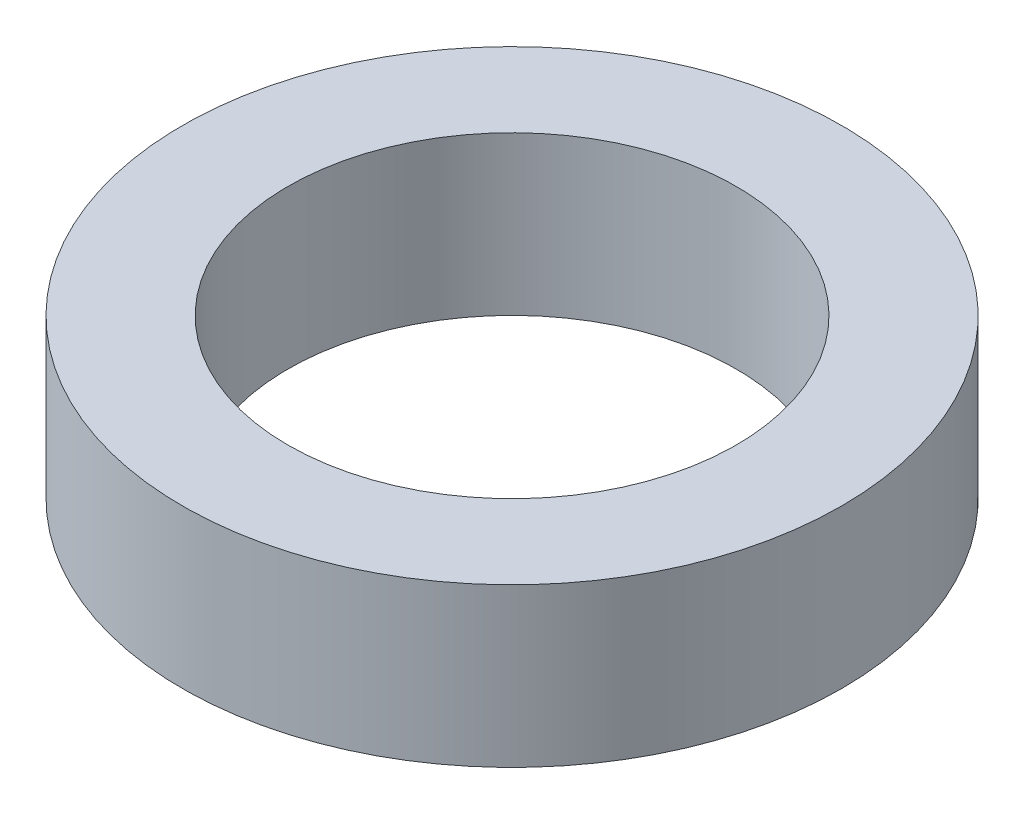
ISO-10303-21;
HEADER;
FILE_DESCRIPTION(('STEP AP214'),'2;1');
FILE_NAME('part.step','',(''),(''),'','','');
FILE_SCHEMA(('AUTOMOTIVE_DESIGN { 1 0 10303 214 1 1 1 1 }'));
ENDSEC;
DATA;
#1=APPLICATION_CONTEXT('core data for automotive mechanical design processes');
#2=APPLICATION_PROTOCOL_DEFINITION('international standard','automotive_design',2000,#1);
#3=PRODUCT_CONTEXT('',#1,'mechanical');
#4=PRODUCT('Part','Part','',(#3));
#5=PRODUCT_RELATED_PRODUCT_CATEGORY('part','',(#4));
#6=PRODUCT_DEFINITION_FORMATION('','',#4);
#7=PRODUCT_DEFINITION_CONTEXT('part definition',#1,'design');
#8=PRODUCT_DEFINITION('design','',#6,#7);
#9=PRODUCT_DEFINITION_SHAPE('','',#8);
#10=(LENGTH_UNIT() NAMED_UNIT(*) SI_UNIT(.MILLI.,.METRE.));
#11=(NAMED_UNIT(*) PLANE_ANGLE_UNIT() SI_UNIT($,.RADIAN.));
#12=(NAMED_UNIT(*) SI_UNIT($,.STERADIAN.) SOLID_ANGLE_UNIT());
#13=UNCERTAINTY_MEASURE_WITH_UNIT(LENGTH_MEASURE(1.E-05),#10,'distance_accuracy_value','');
#14=(GEOMETRIC_REPRESENTATION_CONTEXT(3) GLOBAL_UNCERTAINTY_ASSIGNED_CONTEXT((#13)) GLOBAL_UNIT_ASSIGNED_CONTEXT((#10,
#11,#12)) REPRESENTATION_CONTEXT('',''));
#15=CARTESIAN_POINT('',(0.,0.,0.));
#16=DIRECTION('',(0.,0.,1.));
#17=DIRECTION('',(1.,0.,0.));
#18=AXIS2_PLACEMENT_3D('',#15,#16,#17);
#19=CARTESIAN_POINT('',(0.,3.,0.));
#20=DIRECTION('',(0.,1.,0.));
#21=DIRECTION('',(0.,0.,1.));
#22=AXIS2_PLACEMENT_3D('',#19,#20,#21);
#23=PLANE('',#22);
#24=CARTESIAN_POINT('',(0.,3.,0.));
#25=DIRECTION('',(0.,1.,0.));
#26=DIRECTION('',(1.,0.,0.));
#27=AXIS2_PLACEMENT_3D('',#24,#25,#26);
#28=CIRCLE('',#27,6.25);
#29=CARTESIAN_POINT('',(6.25,3.,0.));
#30=VERTEX_POINT('',#29);
#31=EDGE_CURVE('E11',#30,#30,#28,.T.);
#32=ORIENTED_EDGE('',*,*,#31,.T.);
#33=EDGE_LOOP('',(#32));
#34=FACE_BOUND('',#33,.T.);
#35=CARTESIAN_POINT('',(0.,3.,0.));
#36=DIRECTION('',(0.,1.,0.));
#37=DIRECTION('',(0.,0.,1.));
#38=AXIS2_PLACEMENT_3D('',#35,#36,#37);
#39=CIRCLE('',#38,4.25);
#40=CARTESIAN_POINT('',(0.,3.,4.25));
#41=VERTEX_POINT('',#40);
#42=EDGE_CURVE('E48',#41,#41,#39,.T.);
#43=ORIENTED_EDGE('',*,*,#42,.F.);
#44=EDGE_LOOP('',(#43));
#45=FACE_BOUND('',#44,.T.);
#46=ADVANCED_FACE('F37',(#34,#45),#23,.T.);
#47=CARTESIAN_POINT('',(0.,0.,0.));
#48=DIRECTION('',(0.,1.,0.));
#49=DIRECTION('',(0.,0.,1.));
#50=AXIS2_PLACEMENT_3D('',#47,#48,#49);
#51=PLANE('',#50);
#52=CARTESIAN_POINT('',(0.,0.,0.));
#53=DIRECTION('',(0.,1.,0.));
#54=DIRECTION('',(1.,0.,0.));
#55=AXIS2_PLACEMENT_3D('',#52,#53,#54);
#56=CIRCLE('',#55,6.25);
#57=CARTESIAN_POINT('',(6.25,0.,0.));
#58=VERTEX_POINT('',#57);
#59=EDGE_CURVE('E41',#58,#58,#56,.T.);
#60=ORIENTED_EDGE('',*,*,#59,.F.);
#61=EDGE_LOOP('',(#60));
#62=FACE_BOUND('',#61,.T.);
#63=CARTESIAN_POINT('',(0.,0.,0.));
#64=DIRECTION('',(0.,1.,0.));
#65=DIRECTION('',(0.,0.,1.));
#66=AXIS2_PLACEMENT_3D('',#63,#64,#65);
#67=CIRCLE('',#66,4.25);
#68=CARTESIAN_POINT('',(0.,0.,4.25));
#69=VERTEX_POINT('',#68);
#70=EDGE_CURVE('E50',#69,#69,#67,.T.);
#71=ORIENTED_EDGE('',*,*,#70,.T.);
#72=EDGE_LOOP('',(#71));
#73=FACE_BOUND('',#72,.T.);
#74=ADVANCED_FACE('F60',(#62,#73),#51,.F.);
#75=CARTESIAN_POINT('',(0.,3.,0.));
#76=DIRECTION('',(0.,-1.,0.));
#77=DIRECTION('',(0.,0.,-1.));
#78=AXIS2_PLACEMENT_3D('',#75,#76,#77);
#79=CYLINDRICAL_SURFACE('',#78,6.25);
#80=ORIENTED_EDGE('',*,*,#31,.F.);
#81=EDGE_LOOP('',(#80));
#82=FACE_BOUND('',#81,.T.);
#83=ORIENTED_EDGE('',*,*,#59,.T.);
#84=EDGE_LOOP('',(#83));
#85=FACE_BOUND('',#84,.T.);
#86=ADVANCED_FACE('F39',(#82,#85),#79,.T.);
#87=CARTESIAN_POINT('',(0.,3.,0.));
#88=DIRECTION('',(0.,-1.,0.));
#89=DIRECTION('',(0.,0.,-1.));
#90=AXIS2_PLACEMENT_3D('',#87,#88,#89);
#91=CYLINDRICAL_SURFACE('',#90,4.25);
#92=ORIENTED_EDGE('',*,*,#42,.T.);
#93=EDGE_LOOP('',(#92));
#94=FACE_BOUND('',#93,.T.);
#95=ORIENTED_EDGE('',*,*,#70,.F.);
#96=EDGE_LOOP('',(#95));
#97=FACE_BOUND('',#96,.T.);
#98=ADVANCED_FACE('F56',(#94,#97),#91,.F.);
#99=CLOSED_SHELL('',(#46,#74,#86,#98));
#100=MANIFOLD_SOLID_BREP('B2',#99);
#101=ADVANCED_BREP_SHAPE_REPRESENTATION('',(#18,#100),#14);
#102=SHAPE_DEFINITION_REPRESENTATION(#9,#101);
ENDSEC;
END-ISO-10303-21;
